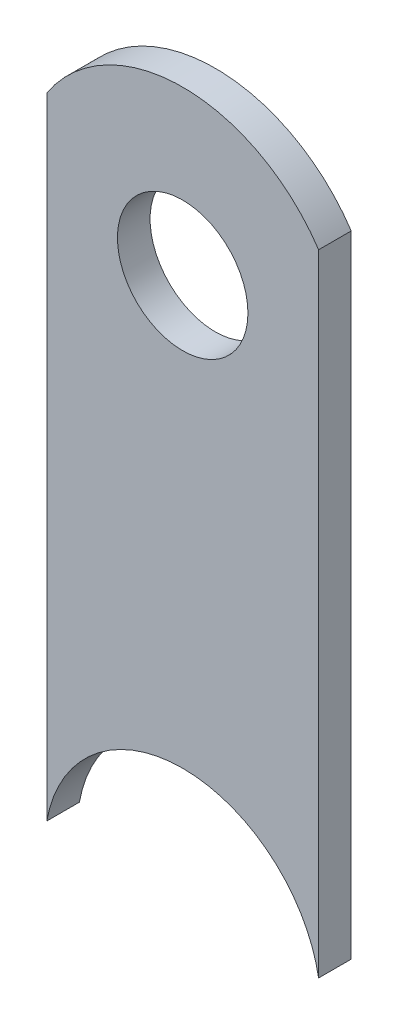
ISO-10303-21;
HEADER;
FILE_DESCRIPTION(('STEP AP214'),'2;1');
FILE_NAME('part.step','',(''),(''),'','','');
FILE_SCHEMA(('AUTOMOTIVE_DESIGN { 1 0 10303 214 1 1 1 1 }'));
ENDSEC;
DATA;
#1=APPLICATION_CONTEXT('core data for automotive mechanical design processes');
#2=APPLICATION_PROTOCOL_DEFINITION('international standard','automotive_design',2000,#1);
#3=PRODUCT_CONTEXT('',#1,'mechanical');
#4=PRODUCT('Part','Part','',(#3));
#5=PRODUCT_RELATED_PRODUCT_CATEGORY('part','',(#4));
#6=PRODUCT_DEFINITION_FORMATION('','',#4);
#7=PRODUCT_DEFINITION_CONTEXT('part definition',#1,'design');
#8=PRODUCT_DEFINITION('design','',#6,#7);
#9=PRODUCT_DEFINITION_SHAPE('','',#8);
#10=(LENGTH_UNIT() NAMED_UNIT(*) SI_UNIT(.MILLI.,.METRE.));
#11=(NAMED_UNIT(*) PLANE_ANGLE_UNIT() SI_UNIT($,.RADIAN.));
#12=(NAMED_UNIT(*) SI_UNIT($,.STERADIAN.) SOLID_ANGLE_UNIT());
#13=UNCERTAINTY_MEASURE_WITH_UNIT(LENGTH_MEASURE(1.E-05),#10,'distance_accuracy_value','');
#14=(GEOMETRIC_REPRESENTATION_CONTEXT(3) GLOBAL_UNCERTAINTY_ASSIGNED_CONTEXT((#13)) GLOBAL_UNIT_ASSIGNED_CONTEXT((#10,
#11,#12)) REPRESENTATION_CONTEXT('',''));
#15=CARTESIAN_POINT('',(0.,0.,0.));
#16=DIRECTION('',(0.,0.,1.));
#17=DIRECTION('',(1.,0.,0.));
#18=AXIS2_PLACEMENT_3D('',#15,#16,#17);
#19=CARTESIAN_POINT('',(0.,-31.2449944320644,-3.));
#20=DIRECTION('',(0.,0.,1.));
#21=DIRECTION('',(1.,0.,0.));
#22=AXIS2_PLACEMENT_3D('',#19,#20,#21);
#23=CYLINDRICAL_SURFACE('',#22,12.7);
#24=CARTESIAN_POINT('',(0.,-31.2449944320644,0.));
#25=DIRECTION('',(0.,0.,-1.));
#26=DIRECTION('',(-1.,0.,0.));
#27=AXIS2_PLACEMENT_3D('',#24,#25,#26);
#28=CIRCLE('',#27,12.7);
#29=CARTESIAN_POINT('',(-12.5,-29.,0.));
#30=VERTEX_POINT('',#29);
#31=CARTESIAN_POINT('',(12.5,-29.,0.));
#32=VERTEX_POINT('',#31);
#33=EDGE_CURVE('E109',#30,#32,#28,.T.);
#34=ORIENTED_EDGE('',*,*,#33,.F.);
#35=DIRECTION('',(0.,0.,1.));
#36=VECTOR('',#35,1.);
#37=CARTESIAN_POINT('',(-12.5,-29.,-3.));
#38=LINE('',#37,#36);
#39=CARTESIAN_POINT('',(-12.5,-29.,-3.));
#40=VERTEX_POINT('',#39);
#41=EDGE_CURVE('E11',#40,#30,#38,.T.);
#42=ORIENTED_EDGE('',*,*,#41,.F.);
#43=CARTESIAN_POINT('',(0.,-31.2449944320644,-3.));
#44=DIRECTION('',(0.,0.,-1.));
#45=DIRECTION('',(-1.,0.,0.));
#46=AXIS2_PLACEMENT_3D('',#43,#44,#45);
#47=CIRCLE('',#46,12.7);
#48=CARTESIAN_POINT('',(12.5,-29.,-3.));
#49=VERTEX_POINT('',#48);
#50=EDGE_CURVE('E102',#40,#49,#47,.T.);
#51=ORIENTED_EDGE('',*,*,#50,.T.);
#52=DIRECTION('',(0.,0.,1.));
#53=VECTOR('',#52,1.);
#54=CARTESIAN_POINT('',(12.5,-29.,-3.));
#55=LINE('',#54,#53);
#56=EDGE_CURVE('E47',#49,#32,#55,.T.);
#57=ORIENTED_EDGE('',*,*,#56,.T.);
#58=EDGE_LOOP('',(#34,#42,#51,#57));
#59=FACE_BOUND('',#58,.T.);
#60=ADVANCED_FACE('F44',(#59),#23,.F.);
#61=CARTESIAN_POINT('',(-12.5,29.,-3.));
#62=DIRECTION('',(-1.,0.,0.));
#63=DIRECTION('',(0.,-1.,0.));
#64=AXIS2_PLACEMENT_3D('',#61,#62,#63);
#65=PLANE('',#64);
#66=DIRECTION('',(0.,-1.,0.));
#67=VECTOR('',#66,1.);
#68=CARTESIAN_POINT('',(-12.5,29.,0.));
#69=LINE('',#68,#67);
#70=CARTESIAN_POINT('',(-12.5,29.,0.));
#71=VERTEX_POINT('',#70);
#72=EDGE_CURVE('E104',#71,#30,#69,.T.);
#73=ORIENTED_EDGE('',*,*,#72,.F.);
#74=DIRECTION('',(0.,0.,1.));
#75=VECTOR('',#74,1.);
#76=CARTESIAN_POINT('',(-12.5,29.,-3.));
#77=LINE('',#76,#75);
#78=CARTESIAN_POINT('',(-12.5,29.,-3.));
#79=VERTEX_POINT('',#78);
#80=EDGE_CURVE('E53',#79,#71,#77,.T.);
#81=ORIENTED_EDGE('',*,*,#80,.F.);
#82=DIRECTION('',(0.,-1.,0.));
#83=VECTOR('',#82,1.);
#84=CARTESIAN_POINT('',(-12.5,29.,-3.));
#85=LINE('',#84,#83);
#86=EDGE_CURVE('E99',#79,#40,#85,.T.);
#87=ORIENTED_EDGE('',*,*,#86,.T.);
#88=ORIENTED_EDGE('',*,*,#41,.T.);
#89=EDGE_LOOP('',(#73,#81,#87,#88));
#90=FACE_BOUND('',#89,.T.);
#91=ADVANCED_FACE('F120',(#90),#65,.T.);
#92=CARTESIAN_POINT('',(0.,20.7084380241115,-3.));
#93=DIRECTION('',(0.,0.,1.));
#94=DIRECTION('',(1.,0.,0.));
#95=AXIS2_PLACEMENT_3D('',#92,#93,#94);
#96=CYLINDRICAL_SURFACE('',#95,15.);
#97=CARTESIAN_POINT('',(0.,20.7084380241115,0.));
#98=DIRECTION('',(0.,0.,1.));
#99=DIRECTION('',(-1.,0.,0.));
#100=AXIS2_PLACEMENT_3D('',#97,#98,#99);
#101=CIRCLE('',#100,15.);
#102=CARTESIAN_POINT('',(12.5,29.,0.));
#103=VERTEX_POINT('',#102);
#104=EDGE_CURVE('E94',#103,#71,#101,.T.);
#105=ORIENTED_EDGE('',*,*,#104,.F.);
#106=DIRECTION('',(0.,0.,1.));
#107=VECTOR('',#106,1.);
#108=CARTESIAN_POINT('',(12.5,29.,-3.));
#109=LINE('',#108,#107);
#110=CARTESIAN_POINT('',(12.5,29.,-3.));
#111=VERTEX_POINT('',#110);
#112=EDGE_CURVE('E89',#111,#103,#109,.T.);
#113=ORIENTED_EDGE('',*,*,#112,.F.);
#114=CARTESIAN_POINT('',(0.,20.7084380241115,-3.));
#115=DIRECTION('',(0.,0.,1.));
#116=DIRECTION('',(-1.,0.,0.));
#117=AXIS2_PLACEMENT_3D('',#114,#115,#116);
#118=CIRCLE('',#117,15.);
#119=EDGE_CURVE('E92',#111,#79,#118,.T.);
#120=ORIENTED_EDGE('',*,*,#119,.T.);
#121=ORIENTED_EDGE('',*,*,#80,.T.);
#122=EDGE_LOOP('',(#105,#113,#120,#121));
#123=FACE_BOUND('',#122,.T.);
#124=ADVANCED_FACE('F91',(#123),#96,.T.);
#125=CARTESIAN_POINT('',(12.5,29.,-3.));
#126=DIRECTION('',(1.,0.,0.));
#127=DIRECTION('',(0.,1.,0.));
#128=AXIS2_PLACEMENT_3D('',#125,#126,#127);
#129=PLANE('',#128);
#130=DIRECTION('',(0.,1.,0.));
#131=VECTOR('',#130,1.);
#132=CARTESIAN_POINT('',(12.5,29.,0.));
#133=LINE('',#132,#131);
#134=EDGE_CURVE('E112',#32,#103,#133,.T.);
#135=ORIENTED_EDGE('',*,*,#134,.F.);
#136=ORIENTED_EDGE('',*,*,#56,.F.);
#137=DIRECTION('',(0.,1.,0.));
#138=VECTOR('',#137,1.);
#139=CARTESIAN_POINT('',(12.5,29.,-3.));
#140=LINE('',#139,#138);
#141=EDGE_CURVE('E98',#49,#111,#140,.T.);
#142=ORIENTED_EDGE('',*,*,#141,.T.);
#143=ORIENTED_EDGE('',*,*,#112,.T.);
#144=EDGE_LOOP('',(#135,#136,#142,#143));
#145=FACE_BOUND('',#144,.T.);
#146=ADVANCED_FACE('F101',(#145),#129,.T.);
#147=CARTESIAN_POINT('',(0.,-31.2449944320644,-3.));
#148=DIRECTION('',(0.,0.,-1.));
#149=DIRECTION('',(-1.,0.,0.));
#150=AXIS2_PLACEMENT_3D('',#147,#148,#149);
#151=PLANE('',#150);
#152=CARTESIAN_POINT('',(0.,20.7084380241115,-3.));
#153=DIRECTION('',(0.,0.,1.));
#154=DIRECTION('',(1.,0.,0.));
#155=AXIS2_PLACEMENT_3D('',#152,#153,#154);
#156=CIRCLE('',#155,6.);
#157=CARTESIAN_POINT('',(6.,20.7084380241115,-3.));
#158=VERTEX_POINT('',#157);
#159=EDGE_CURVE('E113',#158,#158,#156,.T.);
#160=ORIENTED_EDGE('',*,*,#159,.T.);
#161=EDGE_LOOP('',(#160));
#162=FACE_BOUND('',#161,.T.);
#163=ORIENTED_EDGE('',*,*,#50,.F.);
#164=ORIENTED_EDGE('',*,*,#86,.F.);
#165=ORIENTED_EDGE('',*,*,#119,.F.);
#166=ORIENTED_EDGE('',*,*,#141,.F.);
#167=EDGE_LOOP('',(#163,#164,#165,#166));
#168=FACE_BOUND('',#167,.T.);
#169=ADVANCED_FACE('F97',(#162,#168),#151,.T.);
#170=CARTESIAN_POINT('',(0.,-31.2449944320644,0.));
#171=DIRECTION('',(0.,0.,-1.));
#172=DIRECTION('',(-1.,0.,0.));
#173=AXIS2_PLACEMENT_3D('',#170,#171,#172);
#174=PLANE('',#173);
#175=CARTESIAN_POINT('',(0.,20.7084380241115,0.));
#176=DIRECTION('',(0.,0.,1.));
#177=DIRECTION('',(1.,0.,0.));
#178=AXIS2_PLACEMENT_3D('',#175,#176,#177);
#179=CIRCLE('',#178,6.);
#180=CARTESIAN_POINT('',(6.,20.7084380241115,0.));
#181=VERTEX_POINT('',#180);
#182=EDGE_CURVE('E150',#181,#181,#179,.T.);
#183=ORIENTED_EDGE('',*,*,#182,.F.);
#184=EDGE_LOOP('',(#183));
#185=FACE_BOUND('',#184,.T.);
#186=ORIENTED_EDGE('',*,*,#33,.T.);
#187=ORIENTED_EDGE('',*,*,#134,.T.);
#188=ORIENTED_EDGE('',*,*,#104,.T.);
#189=ORIENTED_EDGE('',*,*,#72,.T.);
#190=EDGE_LOOP('',(#186,#187,#188,#189));
#191=FACE_BOUND('',#190,.T.);
#192=ADVANCED_FACE('F119',(#185,#191),#174,.F.);
#193=CARTESIAN_POINT('',(0.,20.7084380241115,-3.));
#194=DIRECTION('',(0.,0.,1.));
#195=DIRECTION('',(1.,0.,0.));
#196=AXIS2_PLACEMENT_3D('',#193,#194,#195);
#197=CYLINDRICAL_SURFACE('',#196,6.);
#198=ORIENTED_EDGE('',*,*,#159,.F.);
#199=EDGE_LOOP('',(#198));
#200=FACE_BOUND('',#199,.T.);
#201=ORIENTED_EDGE('',*,*,#182,.T.);
#202=EDGE_LOOP('',(#201));
#203=FACE_BOUND('',#202,.T.);
#204=ADVANCED_FACE('F138',(#200,#203),#197,.F.);
#205=CLOSED_SHELL('',(#60,#91,#124,#146,#169,#192,#204));
#206=MANIFOLD_SOLID_BREP('B2',#205);
#207=ADVANCED_BREP_SHAPE_REPRESENTATION('',(#18,#206),#14);
#208=SHAPE_DEFINITION_REPRESENTATION(#9,#207);
ENDSEC;
END-ISO-10303-21;
